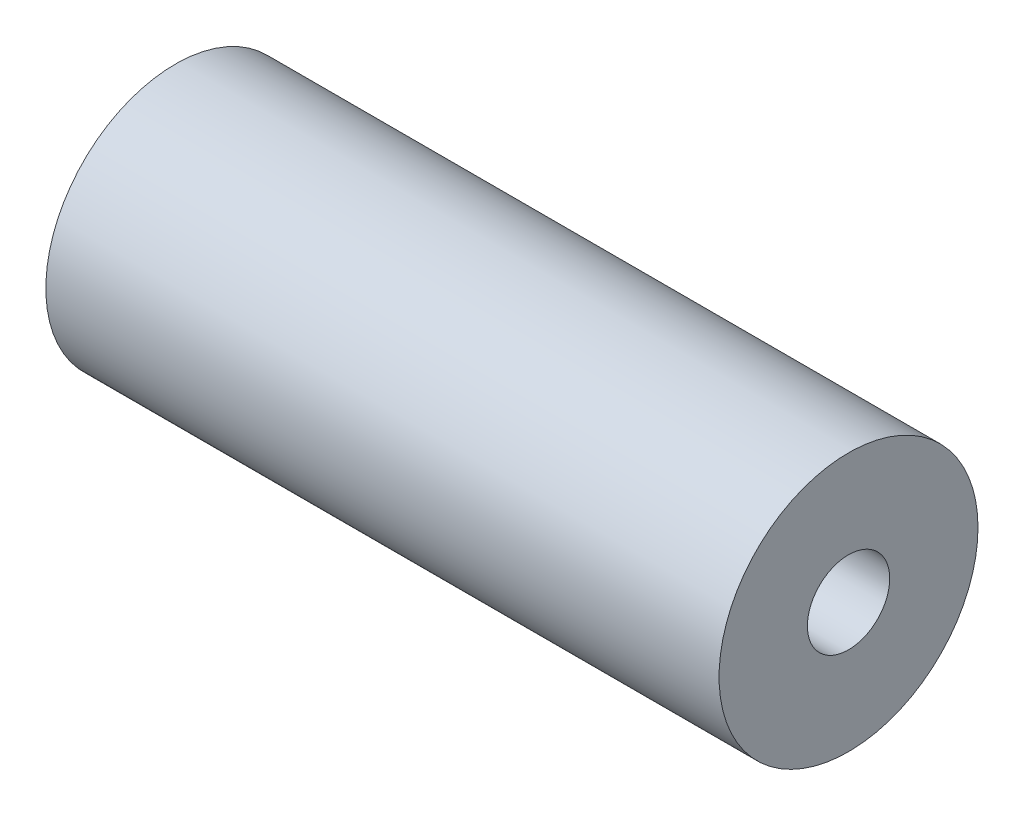
ISO-10303-21;
HEADER;
FILE_DESCRIPTION(('STEP AP214'),'2;1');
FILE_NAME('part.step','',(''),(''),'','','');
FILE_SCHEMA(('AUTOMOTIVE_DESIGN { 1 0 10303 214 1 1 1 1 }'));
ENDSEC;
DATA;
#1=APPLICATION_CONTEXT('core data for automotive mechanical design processes');
#2=APPLICATION_PROTOCOL_DEFINITION('international standard','automotive_design',2000,#1);
#3=PRODUCT_CONTEXT('',#1,'mechanical');
#4=PRODUCT('Part','Part','',(#3));
#5=PRODUCT_RELATED_PRODUCT_CATEGORY('part','',(#4));
#6=PRODUCT_DEFINITION_FORMATION('','',#4);
#7=PRODUCT_DEFINITION_CONTEXT('part definition',#1,'design');
#8=PRODUCT_DEFINITION('design','',#6,#7);
#9=PRODUCT_DEFINITION_SHAPE('','',#8);
#10=(LENGTH_UNIT() NAMED_UNIT(*) SI_UNIT(.MILLI.,.METRE.));
#11=(NAMED_UNIT(*) PLANE_ANGLE_UNIT() SI_UNIT($,.RADIAN.));
#12=(NAMED_UNIT(*) SI_UNIT($,.STERADIAN.) SOLID_ANGLE_UNIT());
#13=UNCERTAINTY_MEASURE_WITH_UNIT(LENGTH_MEASURE(1.E-05),#10,'distance_accuracy_value','');
#14=(GEOMETRIC_REPRESENTATION_CONTEXT(3) GLOBAL_UNCERTAINTY_ASSIGNED_CONTEXT((#13)) GLOBAL_UNIT_ASSIGNED_CONTEXT((#10,
#11,#12)) REPRESENTATION_CONTEXT('',''));
#15=CARTESIAN_POINT('',(0.,0.,0.));
#16=DIRECTION('',(0.,0.,1.));
#17=DIRECTION('',(1.,0.,0.));
#18=AXIS2_PLACEMENT_3D('',#15,#16,#17);
#19=CARTESIAN_POINT('',(16.51,0.,0.));
#20=DIRECTION('',(-1.,0.,0.));
#21=DIRECTION('',(0.,0.,1.));
#22=AXIS2_PLACEMENT_3D('',#19,#20,#21);
#23=CYLINDRICAL_SURFACE('',#22,6.35);
#24=CARTESIAN_POINT('',(16.51,0.,0.));
#25=DIRECTION('',(1.,0.,0.));
#26=DIRECTION('',(0.,0.,-1.));
#27=AXIS2_PLACEMENT_3D('',#24,#25,#26);
#28=CIRCLE('',#27,6.35);
#29=CARTESIAN_POINT('',(16.51,0.,-6.35));
#30=VERTEX_POINT('',#29);
#31=EDGE_CURVE('E11',#30,#30,#28,.T.);
#32=ORIENTED_EDGE('',*,*,#31,.F.);
#33=EDGE_LOOP('',(#32));
#34=FACE_BOUND('',#33,.T.);
#35=CARTESIAN_POINT('',(-16.51,0.,0.));
#36=DIRECTION('',(1.,0.,0.));
#37=DIRECTION('',(0.,0.,-1.));
#38=AXIS2_PLACEMENT_3D('',#35,#36,#37);
#39=CIRCLE('',#38,6.35);
#40=CARTESIAN_POINT('',(-16.51,0.,-6.35));
#41=VERTEX_POINT('',#40);
#42=EDGE_CURVE('E48',#41,#41,#39,.T.);
#43=ORIENTED_EDGE('',*,*,#42,.T.);
#44=EDGE_LOOP('',(#43));
#45=FACE_BOUND('',#44,.T.);
#46=ADVANCED_FACE('F45',(#34,#45),#23,.T.);
#47=CARTESIAN_POINT('',(16.51,0.,0.));
#48=DIRECTION('',(1.,0.,0.));
#49=DIRECTION('',(0.,0.,-1.));
#50=AXIS2_PLACEMENT_3D('',#47,#48,#49);
#51=PLANE('',#50);
#52=CARTESIAN_POINT('',(16.51,0.,0.));
#53=DIRECTION('',(1.,0.,0.));
#54=DIRECTION('',(0.,0.,-1.));
#55=AXIS2_PLACEMENT_3D('',#52,#53,#54);
#56=CIRCLE('',#55,2.01929999999999);
#57=CARTESIAN_POINT('',(16.51,0.,-2.01929999999999));
#58=VERTEX_POINT('',#57);
#59=EDGE_CURVE('E70',#58,#58,#56,.T.);
#60=ORIENTED_EDGE('',*,*,#59,.F.);
#61=EDGE_LOOP('',(#60));
#62=FACE_BOUND('',#61,.T.);
#63=ORIENTED_EDGE('',*,*,#31,.T.);
#64=EDGE_LOOP('',(#63));
#65=FACE_BOUND('',#64,.T.);
#66=ADVANCED_FACE('F93',(#62,#65),#51,.T.);
#67=CARTESIAN_POINT('',(-16.51,0.,0.));
#68=DIRECTION('',(1.,0.,0.));
#69=DIRECTION('',(0.,0.,-1.));
#70=AXIS2_PLACEMENT_3D('',#67,#68,#69);
#71=PLANE('',#70);
#72=CARTESIAN_POINT('',(-16.51,0.,0.));
#73=DIRECTION('',(-1.,0.,0.));
#74=DIRECTION('',(0.,0.,1.));
#75=AXIS2_PLACEMENT_3D('',#72,#73,#74);
#76=CIRCLE('',#75,2.01929999999999);
#77=CARTESIAN_POINT('',(-16.51,0.,2.01929999999999));
#78=VERTEX_POINT('',#77);
#79=EDGE_CURVE('E71',#78,#78,#76,.T.);
#80=ORIENTED_EDGE('',*,*,#79,.F.);
#81=EDGE_LOOP('',(#80));
#82=FACE_BOUND('',#81,.T.);
#83=ORIENTED_EDGE('',*,*,#42,.F.);
#84=EDGE_LOOP('',(#83));
#85=FACE_BOUND('',#84,.T.);
#86=ADVANCED_FACE('F90',(#82,#85),#71,.F.);
#87=CARTESIAN_POINT('',(5.08,0.,0.));
#88=DIRECTION('',(1.,0.,0.));
#89=DIRECTION('',(0.,0.,-1.));
#90=AXIS2_PLACEMENT_3D('',#87,#88,#89);
#91=CONICAL_SURFACE('',#90,2.0193,1.02974425867665);
#92=CARTESIAN_POINT('',(3.86668215199765,0.,0.));
#93=VERTEX_POINT('',#92);
#94=VERTEX_LOOP('',#93);
#95=FACE_BOUND('',#94,.T.);
#96=CARTESIAN_POINT('',(5.08,0.,0.));
#97=DIRECTION('',(1.,0.,0.));
#98=DIRECTION('',(0.,0.,-1.));
#99=AXIS2_PLACEMENT_3D('',#96,#97,#98);
#100=CIRCLE('',#99,2.0193);
#101=CARTESIAN_POINT('',(5.08,0.,-2.0193));
#102=VERTEX_POINT('',#101);
#103=EDGE_CURVE('E76',#102,#102,#100,.T.);
#104=ORIENTED_EDGE('',*,*,#103,.T.);
#105=EDGE_LOOP('',(#104));
#106=FACE_BOUND('',#105,.T.);
#107=ADVANCED_FACE('F92',(#95,#106),#91,.F.);
#108=CARTESIAN_POINT('',(16.51,0.,0.));
#109=DIRECTION('',(1.,0.,0.));
#110=DIRECTION('',(0.,0.,-1.));
#111=AXIS2_PLACEMENT_3D('',#108,#109,#110);
#112=CYLINDRICAL_SURFACE('',#111,2.01929999999999);
#113=ORIENTED_EDGE('',*,*,#103,.F.);
#114=EDGE_LOOP('',(#113));
#115=FACE_BOUND('',#114,.T.);
#116=ORIENTED_EDGE('',*,*,#59,.T.);
#117=EDGE_LOOP('',(#116));
#118=FACE_BOUND('',#117,.T.);
#119=ADVANCED_FACE('F63',(#115,#118),#112,.F.);
#120=CARTESIAN_POINT('',(-5.08,0.,0.));
#121=DIRECTION('',(-1.,0.,0.));
#122=DIRECTION('',(0.,0.,1.));
#123=AXIS2_PLACEMENT_3D('',#120,#121,#122);
#124=CONICAL_SURFACE('',#123,2.0193,1.02974425867665);
#125=CARTESIAN_POINT('',(-3.86668215199765,0.,0.));
#126=VERTEX_POINT('',#125);
#127=VERTEX_LOOP('',#126);
#128=FACE_BOUND('',#127,.T.);
#129=CARTESIAN_POINT('',(-5.08,0.,0.));
#130=DIRECTION('',(-1.,0.,0.));
#131=DIRECTION('',(0.,0.,1.));
#132=AXIS2_PLACEMENT_3D('',#129,#130,#131);
#133=CIRCLE('',#132,2.0193);
#134=CARTESIAN_POINT('',(-5.08,0.,2.0193));
#135=VERTEX_POINT('',#134);
#136=EDGE_CURVE('E67',#135,#135,#133,.T.);
#137=ORIENTED_EDGE('',*,*,#136,.T.);
#138=EDGE_LOOP('',(#137));
#139=FACE_BOUND('',#138,.T.);
#140=ADVANCED_FACE('F59',(#128,#139),#124,.F.);
#141=CARTESIAN_POINT('',(-16.51,0.,0.));
#142=DIRECTION('',(-1.,0.,0.));
#143=DIRECTION('',(0.,0.,1.));
#144=AXIS2_PLACEMENT_3D('',#141,#142,#143);
#145=CYLINDRICAL_SURFACE('',#144,2.01929999999999);
#146=ORIENTED_EDGE('',*,*,#136,.F.);
#147=EDGE_LOOP('',(#146));
#148=FACE_BOUND('',#147,.T.);
#149=ORIENTED_EDGE('',*,*,#79,.T.);
#150=EDGE_LOOP('',(#149));
#151=FACE_BOUND('',#150,.T.);
#152=ADVANCED_FACE('F62',(#148,#151),#145,.F.);
#153=CLOSED_SHELL('',(#46,#66,#86,#107,#119,#140,#152));
#154=MANIFOLD_SOLID_BREP('B2',#153);
#155=ADVANCED_BREP_SHAPE_REPRESENTATION('',(#18,#154),#14);
#156=SHAPE_DEFINITION_REPRESENTATION(#9,#155);
ENDSEC;
END-ISO-10303-21;
